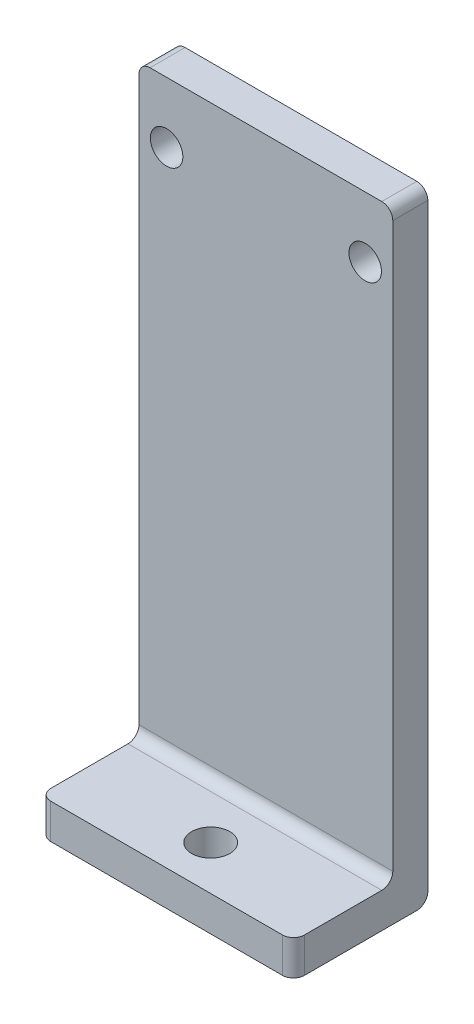
ISO-10303-21;
HEADER;
FILE_DESCRIPTION(('STEP AP214'),'2;1');
FILE_NAME('part.step','',(''),(''),'','','');
FILE_SCHEMA(('AUTOMOTIVE_DESIGN { 1 0 10303 214 1 1 1 1 }'));
ENDSEC;
DATA;
#1=APPLICATION_CONTEXT('core data for automotive mechanical design processes');
#2=APPLICATION_PROTOCOL_DEFINITION('international standard','automotive_design',2000,#1);
#3=PRODUCT_CONTEXT('',#1,'mechanical');
#4=PRODUCT('Part','Part','',(#3));
#5=PRODUCT_RELATED_PRODUCT_CATEGORY('part','',(#4));
#6=PRODUCT_DEFINITION_FORMATION('','',#4);
#7=PRODUCT_DEFINITION_CONTEXT('part definition',#1,'design');
#8=PRODUCT_DEFINITION('design','',#6,#7);
#9=PRODUCT_DEFINITION_SHAPE('','',#8);
#10=(LENGTH_UNIT() NAMED_UNIT(*) SI_UNIT(.MILLI.,.METRE.));
#11=(NAMED_UNIT(*) PLANE_ANGLE_UNIT() SI_UNIT($,.RADIAN.));
#12=(NAMED_UNIT(*) SI_UNIT($,.STERADIAN.) SOLID_ANGLE_UNIT());
#13=UNCERTAINTY_MEASURE_WITH_UNIT(LENGTH_MEASURE(1.E-05),#10,'distance_accuracy_value','');
#14=(GEOMETRIC_REPRESENTATION_CONTEXT(3) GLOBAL_UNCERTAINTY_ASSIGNED_CONTEXT((#13)) GLOBAL_UNIT_ASSIGNED_CONTEXT((#10,
#11,#12)) REPRESENTATION_CONTEXT('',''));
#15=CARTESIAN_POINT('',(0.,0.,0.));
#16=DIRECTION('',(0.,0.,1.));
#17=DIRECTION('',(1.,0.,0.));
#18=AXIS2_PLACEMENT_3D('',#15,#16,#17);
#19=CARTESIAN_POINT('',(23.,0.,3.175));
#20=DIRECTION('',(1.,0.,0.));
#21=DIRECTION('',(0.,1.,0.));
#22=AXIS2_PLACEMENT_3D('',#19,#20,#21);
#23=PLANE('',#22);
#24=DIRECTION('',(0.,0.,-1.));
#25=VECTOR('',#24,1.);
#26=CARTESIAN_POINT('',(23.,-53.06,12.175));
#27=LINE('',#26,#25);
#28=CARTESIAN_POINT('',(23.,-53.06,11.175));
#29=VERTEX_POINT('',#28);
#30=CARTESIAN_POINT('',(23.,-53.06,4.175));
#31=VERTEX_POINT('',#30);
#32=EDGE_CURVE('E170',#29,#31,#27,.T.);
#33=ORIENTED_EDGE('',*,*,#32,.F.);
#34=DIRECTION('',(0.,1.,0.));
#35=VECTOR('',#34,1.);
#36=CARTESIAN_POINT('',(23.,0.,11.175));
#37=LINE('',#36,#35);
#38=CARTESIAN_POINT('',(23.,-56.235,11.175));
#39=VERTEX_POINT('',#38);
#40=EDGE_CURVE('E265',#29,#39,#37,.F.);
#41=ORIENTED_EDGE('',*,*,#40,.T.);
#42=DIRECTION('',(0.,0.,-1.));
#43=VECTOR('',#42,1.);
#44=CARTESIAN_POINT('',(23.,-56.235,3.175));
#45=LINE('',#44,#43);
#46=CARTESIAN_POINT('',(23.,-56.235,1.));
#47=VERTEX_POINT('',#46);
#48=EDGE_CURVE('E202',#39,#47,#45,.T.);
#49=ORIENTED_EDGE('',*,*,#48,.T.);
#50=CARTESIAN_POINT('',(23.,-55.235,1.));
#51=DIRECTION('',(1.,0.,0.));
#52=DIRECTION('',(0.,1.,0.));
#53=AXIS2_PLACEMENT_3D('',#50,#51,#52);
#54=CIRCLE('',#53,1.);
#55=CARTESIAN_POINT('',(23.,-55.235,0.));
#56=VERTEX_POINT('',#55);
#57=EDGE_CURVE('E262',#47,#56,#54,.T.);
#58=ORIENTED_EDGE('',*,*,#57,.T.);
#59=DIRECTION('',(0.,-1.,0.));
#60=VECTOR('',#59,1.);
#61=CARTESIAN_POINT('',(23.,0.,0.));
#62=LINE('',#61,#60);
#63=CARTESIAN_POINT('',(23.,-1.,0.));
#64=VERTEX_POINT('',#63);
#65=EDGE_CURVE('E210',#64,#56,#62,.T.);
#66=ORIENTED_EDGE('',*,*,#65,.F.);
#67=DIRECTION('',(0.,0.,-1.));
#68=VECTOR('',#67,1.);
#69=CARTESIAN_POINT('',(23.,-1.,3.175));
#70=LINE('',#69,#68);
#71=CARTESIAN_POINT('',(23.,-1.,3.175));
#72=VERTEX_POINT('',#71);
#73=EDGE_CURVE('E259',#64,#72,#70,.F.);
#74=ORIENTED_EDGE('',*,*,#73,.T.);
#75=DIRECTION('',(0.,-1.,0.));
#76=VECTOR('',#75,1.);
#77=CARTESIAN_POINT('',(23.,0.,3.175));
#78=LINE('',#77,#76);
#79=CARTESIAN_POINT('',(23.,-52.06,3.175));
#80=VERTEX_POINT('',#79);
#81=EDGE_CURVE('E190',#72,#80,#78,.T.);
#82=ORIENTED_EDGE('',*,*,#81,.T.);
#83=CARTESIAN_POINT('',(23.,-52.06,4.175));
#84=DIRECTION('',(1.,0.,0.));
#85=DIRECTION('',(0.,1.,0.));
#86=AXIS2_PLACEMENT_3D('',#83,#84,#85);
#87=CIRCLE('',#86,1.);
#88=EDGE_CURVE('E11',#80,#31,#87,.F.);
#89=ORIENTED_EDGE('',*,*,#88,.T.);
#90=EDGE_LOOP('',(#33,#41,#49,#58,#66,#74,#82,#89));
#91=FACE_BOUND('',#90,.T.);
#92=ADVANCED_FACE('F49',(#91),#23,.T.);
#93=CARTESIAN_POINT('',(0.,0.,3.175));
#94=DIRECTION('',(0.,1.,0.));
#95=DIRECTION('',(0.,0.,1.));
#96=AXIS2_PLACEMENT_3D('',#93,#94,#95);
#97=PLANE('',#96);
#98=DIRECTION('',(1.,0.,0.));
#99=VECTOR('',#98,1.);
#100=CARTESIAN_POINT('',(0.,0.,0.));
#101=LINE('',#100,#99);
#102=CARTESIAN_POINT('',(1.,0.,0.));
#103=VERTEX_POINT('',#102);
#104=CARTESIAN_POINT('',(22.,0.,0.));
#105=VERTEX_POINT('',#104);
#106=EDGE_CURVE('E214',#103,#105,#101,.T.);
#107=ORIENTED_EDGE('',*,*,#106,.F.);
#108=DIRECTION('',(0.,0.,-1.));
#109=VECTOR('',#108,1.);
#110=CARTESIAN_POINT('',(1.,0.,3.175));
#111=LINE('',#110,#109);
#112=CARTESIAN_POINT('',(1.,0.,3.175));
#113=VERTEX_POINT('',#112);
#114=EDGE_CURVE('E278',#103,#113,#111,.F.);
#115=ORIENTED_EDGE('',*,*,#114,.T.);
#116=DIRECTION('',(1.,0.,0.));
#117=VECTOR('',#116,1.);
#118=CARTESIAN_POINT('',(0.,0.,3.175));
#119=LINE('',#118,#117);
#120=CARTESIAN_POINT('',(22.,0.,3.175));
#121=VERTEX_POINT('',#120);
#122=EDGE_CURVE('E194',#113,#121,#119,.T.);
#123=ORIENTED_EDGE('',*,*,#122,.T.);
#124=DIRECTION('',(0.,0.,-1.));
#125=VECTOR('',#124,1.);
#126=CARTESIAN_POINT('',(22.,0.,3.175));
#127=LINE('',#126,#125);
#128=EDGE_CURVE('E275',#121,#105,#127,.T.);
#129=ORIENTED_EDGE('',*,*,#128,.T.);
#130=EDGE_LOOP('',(#107,#115,#123,#129));
#131=FACE_BOUND('',#130,.T.);
#132=ADVANCED_FACE('F317',(#131),#97,.T.);
#133=CARTESIAN_POINT('',(0.,0.,3.175));
#134=DIRECTION('',(1.,0.,0.));
#135=DIRECTION('',(0.,1.,0.));
#136=AXIS2_PLACEMENT_3D('',#133,#134,#135);
#137=PLANE('',#136);
#138=DIRECTION('',(0.,0.,-1.));
#139=VECTOR('',#138,1.);
#140=CARTESIAN_POINT('',(0.,-56.235,3.175));
#141=LINE('',#140,#139);
#142=CARTESIAN_POINT('',(0.,-56.235,11.175));
#143=VERTEX_POINT('',#142);
#144=CARTESIAN_POINT('',(0.,-56.235,1.));
#145=VERTEX_POINT('',#144);
#146=EDGE_CURVE('E160',#143,#145,#141,.T.);
#147=ORIENTED_EDGE('',*,*,#146,.F.);
#148=DIRECTION('',(0.,1.,0.));
#149=VECTOR('',#148,1.);
#150=CARTESIAN_POINT('',(0.,-53.06,11.175));
#151=LINE('',#150,#149);
#152=CARTESIAN_POINT('',(0.,-53.06,11.175));
#153=VERTEX_POINT('',#152);
#154=EDGE_CURVE('E144',#143,#153,#151,.T.);
#155=ORIENTED_EDGE('',*,*,#154,.T.);
#156=DIRECTION('',(0.,0.,-1.));
#157=VECTOR('',#156,1.);
#158=CARTESIAN_POINT('',(0.,-53.06,12.175));
#159=LINE('',#158,#157);
#160=CARTESIAN_POINT('',(0.,-53.06,4.175));
#161=VERTEX_POINT('',#160);
#162=EDGE_CURVE('E158',#153,#161,#159,.T.);
#163=ORIENTED_EDGE('',*,*,#162,.T.);
#164=CARTESIAN_POINT('',(0.,-52.06,4.175));
#165=DIRECTION('',(1.,0.,0.));
#166=DIRECTION('',(0.,1.,0.));
#167=AXIS2_PLACEMENT_3D('',#164,#165,#166);
#168=CIRCLE('',#167,1.);
#169=CARTESIAN_POINT('',(0.,-52.06,3.175));
#170=VERTEX_POINT('',#169);
#171=EDGE_CURVE('E58',#161,#170,#168,.T.);
#172=ORIENTED_EDGE('',*,*,#171,.T.);
#173=DIRECTION('',(0.,-1.,0.));
#174=VECTOR('',#173,1.);
#175=CARTESIAN_POINT('',(0.,0.,3.175));
#176=LINE('',#175,#174);
#177=CARTESIAN_POINT('',(0.,-1.,3.175));
#178=VERTEX_POINT('',#177);
#179=EDGE_CURVE('E198',#178,#170,#176,.T.);
#180=ORIENTED_EDGE('',*,*,#179,.F.);
#181=DIRECTION('',(0.,0.,-1.));
#182=VECTOR('',#181,1.);
#183=CARTESIAN_POINT('',(0.,-1.,0.));
#184=LINE('',#183,#182);
#185=CARTESIAN_POINT('',(0.,-1.,0.));
#186=VERTEX_POINT('',#185);
#187=EDGE_CURVE('E238',#178,#186,#184,.T.);
#188=ORIENTED_EDGE('',*,*,#187,.T.);
#189=DIRECTION('',(0.,-1.,0.));
#190=VECTOR('',#189,1.);
#191=CARTESIAN_POINT('',(0.,0.,0.));
#192=LINE('',#191,#190);
#193=CARTESIAN_POINT('',(0.,-55.235,0.));
#194=VERTEX_POINT('',#193);
#195=EDGE_CURVE('E186',#186,#194,#192,.T.);
#196=ORIENTED_EDGE('',*,*,#195,.T.);
#197=CARTESIAN_POINT('',(0.,-55.235,1.));
#198=DIRECTION('',(1.,0.,0.));
#199=DIRECTION('',(0.,1.,0.));
#200=AXIS2_PLACEMENT_3D('',#197,#198,#199);
#201=CIRCLE('',#200,1.);
#202=EDGE_CURVE('E163',#194,#145,#201,.F.);
#203=ORIENTED_EDGE('',*,*,#202,.T.);
#204=EDGE_LOOP('',(#147,#155,#163,#172,#180,#188,#196,#203));
#205=FACE_BOUND('',#204,.T.);
#206=ADVANCED_FACE('F157',(#205),#137,.F.);
#207=CARTESIAN_POINT('',(2.5,-5.5,3.175));
#208=DIRECTION('',(0.,0.,-1.));
#209=DIRECTION('',(-1.,0.,0.));
#210=AXIS2_PLACEMENT_3D('',#207,#208,#209);
#211=CYLINDRICAL_SURFACE('',#210,1.4732);
#212=CARTESIAN_POINT('',(2.5,-5.5,3.175));
#213=DIRECTION('',(0.,0.,1.));
#214=DIRECTION('',(1.,0.,0.));
#215=AXIS2_PLACEMENT_3D('',#212,#213,#214);
#216=CIRCLE('',#215,1.4732);
#217=CARTESIAN_POINT('',(3.9732,-5.5,3.175));
#218=VERTEX_POINT('',#217);
#219=EDGE_CURVE('E185',#218,#218,#216,.T.);
#220=ORIENTED_EDGE('',*,*,#219,.T.);
#221=EDGE_LOOP('',(#220));
#222=FACE_BOUND('',#221,.T.);
#223=CARTESIAN_POINT('',(2.5,-5.5,0.));
#224=DIRECTION('',(0.,0.,1.));
#225=DIRECTION('',(1.,0.,0.));
#226=AXIS2_PLACEMENT_3D('',#223,#224,#225);
#227=CIRCLE('',#226,1.4732);
#228=CARTESIAN_POINT('',(3.9732,-5.5,0.));
#229=VERTEX_POINT('',#228);
#230=EDGE_CURVE('E206',#229,#229,#227,.T.);
#231=ORIENTED_EDGE('',*,*,#230,.F.);
#232=EDGE_LOOP('',(#231));
#233=FACE_BOUND('',#232,.T.);
#234=ADVANCED_FACE('F331',(#222,#233),#211,.F.);
#235=CARTESIAN_POINT('',(20.5,-5.5,3.175));
#236=DIRECTION('',(0.,0.,-1.));
#237=DIRECTION('',(-1.,0.,0.));
#238=AXIS2_PLACEMENT_3D('',#235,#236,#237);
#239=CYLINDRICAL_SURFACE('',#238,1.4732);
#240=CARTESIAN_POINT('',(20.5,-5.5,3.175));
#241=DIRECTION('',(0.,0.,1.));
#242=DIRECTION('',(1.,0.,0.));
#243=AXIS2_PLACEMENT_3D('',#240,#241,#242);
#244=CIRCLE('',#243,1.4732);
#245=CARTESIAN_POINT('',(21.9732,-5.5,3.175));
#246=VERTEX_POINT('',#245);
#247=EDGE_CURVE('E181',#246,#246,#244,.T.);
#248=ORIENTED_EDGE('',*,*,#247,.T.);
#249=EDGE_LOOP('',(#248));
#250=FACE_BOUND('',#249,.T.);
#251=CARTESIAN_POINT('',(20.5,-5.5,0.));
#252=DIRECTION('',(0.,0.,1.));
#253=DIRECTION('',(1.,0.,0.));
#254=AXIS2_PLACEMENT_3D('',#251,#252,#253);
#255=CIRCLE('',#254,1.4732);
#256=CARTESIAN_POINT('',(21.9732,-5.5,0.));
#257=VERTEX_POINT('',#256);
#258=EDGE_CURVE('E175',#257,#257,#255,.T.);
#259=ORIENTED_EDGE('',*,*,#258,.F.);
#260=EDGE_LOOP('',(#259));
#261=FACE_BOUND('',#260,.T.);
#262=ADVANCED_FACE('F334',(#250,#261),#239,.F.);
#263=CARTESIAN_POINT('',(0.,-56.235,3.175));
#264=DIRECTION('',(0.,1.,0.));
#265=DIRECTION('',(0.,0.,1.));
#266=AXIS2_PLACEMENT_3D('',#263,#264,#265);
#267=PLANE('',#266);
#268=CARTESIAN_POINT('',(11.5,-56.235,8.175));
#269=DIRECTION('',(0.,1.,0.));
#270=DIRECTION('',(0.,0.,1.));
#271=AXIS2_PLACEMENT_3D('',#268,#269,#270);
#272=CIRCLE('',#271,1.7272);
#273=CARTESIAN_POINT('',(11.5,-56.235,9.9022));
#274=VERTEX_POINT('',#273);
#275=EDGE_CURVE('E521',#274,#274,#272,.T.);
#276=ORIENTED_EDGE('',*,*,#275,.T.);
#277=EDGE_LOOP('',(#276));
#278=FACE_BOUND('',#277,.T.);
#279=DIRECTION('',(-1.,0.,0.));
#280=VECTOR('',#279,1.);
#281=CARTESIAN_POINT('',(0.,-56.235,12.175));
#282=LINE('',#281,#280);
#283=CARTESIAN_POINT('',(22.,-56.235,12.175));
#284=VERTEX_POINT('',#283);
#285=CARTESIAN_POINT('',(1.00000000000001,-56.235,12.175));
#286=VERTEX_POINT('',#285);
#287=EDGE_CURVE('E171',#284,#286,#282,.T.);
#288=ORIENTED_EDGE('',*,*,#287,.T.);
#289=CARTESIAN_POINT('',(1.00000000000001,-56.235,11.175));
#290=DIRECTION('',(0.,1.,0.));
#291=DIRECTION('',(0.,0.,1.));
#292=AXIS2_PLACEMENT_3D('',#289,#290,#291);
#293=CIRCLE('',#292,1.);
#294=EDGE_CURVE('E256',#286,#143,#293,.F.);
#295=ORIENTED_EDGE('',*,*,#294,.T.);
#296=ORIENTED_EDGE('',*,*,#146,.T.);
#297=DIRECTION('',(1.,0.,0.));
#298=VECTOR('',#297,1.);
#299=CARTESIAN_POINT('',(0.,-56.235,1.));
#300=LINE('',#299,#298);
#301=EDGE_CURVE('E249',#145,#47,#300,.T.);
#302=ORIENTED_EDGE('',*,*,#301,.T.);
#303=ORIENTED_EDGE('',*,*,#48,.F.);
#304=CARTESIAN_POINT('',(22.,-56.235,11.175));
#305=DIRECTION('',(0.,1.,0.));
#306=DIRECTION('',(0.,0.,1.));
#307=AXIS2_PLACEMENT_3D('',#304,#305,#306);
#308=CIRCLE('',#307,1.);
#309=EDGE_CURVE('E253',#39,#284,#308,.F.);
#310=ORIENTED_EDGE('',*,*,#309,.T.);
#311=EDGE_LOOP('',(#288,#295,#296,#302,#303,#310));
#312=FACE_BOUND('',#311,.T.);
#313=ADVANCED_FACE('F304',(#278,#312),#267,.F.);
#314=CARTESIAN_POINT('',(0.,0.,3.175));
#315=DIRECTION('',(0.,0.,1.));
#316=DIRECTION('',(1.,0.,0.));
#317=AXIS2_PLACEMENT_3D('',#314,#315,#316);
#318=PLANE('',#317);
#319=ORIENTED_EDGE('',*,*,#179,.T.);
#320=DIRECTION('',(-1.,0.,0.));
#321=VECTOR('',#320,1.);
#322=CARTESIAN_POINT('',(0.,-52.06,3.175));
#323=LINE('',#322,#321);
#324=EDGE_CURVE('E235',#170,#80,#323,.F.);
#325=ORIENTED_EDGE('',*,*,#324,.T.);
#326=ORIENTED_EDGE('',*,*,#81,.F.);
#327=CARTESIAN_POINT('',(22.,-1.,3.175));
#328=DIRECTION('',(0.,0.,1.));
#329=DIRECTION('',(1.,0.,0.));
#330=AXIS2_PLACEMENT_3D('',#327,#328,#329);
#331=CIRCLE('',#330,1.);
#332=EDGE_CURVE('E229',#72,#121,#331,.T.);
#333=ORIENTED_EDGE('',*,*,#332,.T.);
#334=ORIENTED_EDGE('',*,*,#122,.F.);
#335=CARTESIAN_POINT('',(1.,-1.,3.175));
#336=DIRECTION('',(0.,0.,1.));
#337=DIRECTION('',(1.,0.,0.));
#338=AXIS2_PLACEMENT_3D('',#335,#336,#337);
#339=CIRCLE('',#338,1.);
#340=EDGE_CURVE('E232',#113,#178,#339,.T.);
#341=ORIENTED_EDGE('',*,*,#340,.T.);
#342=EDGE_LOOP('',(#319,#325,#326,#333,#334,#341));
#343=FACE_BOUND('',#342,.T.);
#344=ORIENTED_EDGE('',*,*,#247,.F.);
#345=EDGE_LOOP('',(#344));
#346=FACE_BOUND('',#345,.T.);
#347=ORIENTED_EDGE('',*,*,#219,.F.);
#348=EDGE_LOOP('',(#347));
#349=FACE_BOUND('',#348,.T.);
#350=ADVANCED_FACE('F286',(#343,#346,#349),#318,.T.);
#351=CARTESIAN_POINT('',(0.,0.,0.));
#352=DIRECTION('',(0.,0.,1.));
#353=DIRECTION('',(1.,0.,0.));
#354=AXIS2_PLACEMENT_3D('',#351,#352,#353);
#355=PLANE('',#354);
#356=ORIENTED_EDGE('',*,*,#258,.T.);
#357=EDGE_LOOP('',(#356));
#358=FACE_BOUND('',#357,.T.);
#359=ORIENTED_EDGE('',*,*,#230,.T.);
#360=EDGE_LOOP('',(#359));
#361=FACE_BOUND('',#360,.T.);
#362=ORIENTED_EDGE('',*,*,#65,.T.);
#363=DIRECTION('',(1.,0.,0.));
#364=VECTOR('',#363,1.);
#365=CARTESIAN_POINT('',(0.,-55.235,0.));
#366=LINE('',#365,#364);
#367=EDGE_CURVE('E272',#56,#194,#366,.F.);
#368=ORIENTED_EDGE('',*,*,#367,.T.);
#369=ORIENTED_EDGE('',*,*,#195,.F.);
#370=CARTESIAN_POINT('',(1.,-1.,0.));
#371=DIRECTION('',(0.,0.,1.));
#372=DIRECTION('',(1.,0.,0.));
#373=AXIS2_PLACEMENT_3D('',#370,#371,#372);
#374=CIRCLE('',#373,1.);
#375=EDGE_CURVE('E73',#186,#103,#374,.F.);
#376=ORIENTED_EDGE('',*,*,#375,.T.);
#377=ORIENTED_EDGE('',*,*,#106,.T.);
#378=CARTESIAN_POINT('',(22.,-1.,0.));
#379=DIRECTION('',(0.,0.,1.));
#380=DIRECTION('',(1.,0.,0.));
#381=AXIS2_PLACEMENT_3D('',#378,#379,#380);
#382=CIRCLE('',#381,1.);
#383=EDGE_CURVE('E65',#105,#64,#382,.F.);
#384=ORIENTED_EDGE('',*,*,#383,.T.);
#385=EDGE_LOOP('',(#362,#368,#369,#376,#377,#384));
#386=FACE_BOUND('',#385,.T.);
#387=ADVANCED_FACE('F310',(#358,#361,#386),#355,.F.);
#388=CARTESIAN_POINT('',(0.,-53.06,12.175));
#389=DIRECTION('',(0.,-1.,0.));
#390=DIRECTION('',(0.,0.,-1.));
#391=AXIS2_PLACEMENT_3D('',#388,#389,#390);
#392=PLANE('',#391);
#393=CARTESIAN_POINT('',(11.5,-53.06,8.175));
#394=DIRECTION('',(0.,1.,0.));
#395=DIRECTION('',(0.,0.,1.));
#396=AXIS2_PLACEMENT_3D('',#393,#394,#395);
#397=CIRCLE('',#396,1.7272);
#398=CARTESIAN_POINT('',(11.5,-53.06,9.9022));
#399=VERTEX_POINT('',#398);
#400=EDGE_CURVE('E523',#399,#399,#397,.T.);
#401=ORIENTED_EDGE('',*,*,#400,.F.);
#402=EDGE_LOOP('',(#401));
#403=FACE_BOUND('',#402,.T.);
#404=ORIENTED_EDGE('',*,*,#32,.T.);
#405=DIRECTION('',(-1.,0.,0.));
#406=VECTOR('',#405,1.);
#407=CARTESIAN_POINT('',(0.,-53.06,4.175));
#408=LINE('',#407,#406);
#409=EDGE_CURVE('E151',#31,#161,#408,.T.);
#410=ORIENTED_EDGE('',*,*,#409,.T.);
#411=ORIENTED_EDGE('',*,*,#162,.F.);
#412=CARTESIAN_POINT('',(1.00000000000001,-53.06,11.175));
#413=DIRECTION('',(0.,-1.,0.));
#414=DIRECTION('',(0.,0.,-1.));
#415=AXIS2_PLACEMENT_3D('',#412,#413,#414);
#416=CIRCLE('',#415,1.);
#417=CARTESIAN_POINT('',(1.00000000000001,-53.06,12.175));
#418=VERTEX_POINT('',#417);
#419=EDGE_CURVE('E140',#153,#418,#416,.F.);
#420=ORIENTED_EDGE('',*,*,#419,.T.);
#421=DIRECTION('',(-1.,0.,0.));
#422=VECTOR('',#421,1.);
#423=CARTESIAN_POINT('',(0.,-53.06,12.175));
#424=LINE('',#423,#422);
#425=CARTESIAN_POINT('',(22.,-53.06,12.175));
#426=VERTEX_POINT('',#425);
#427=EDGE_CURVE('E178',#426,#418,#424,.T.);
#428=ORIENTED_EDGE('',*,*,#427,.F.);
#429=CARTESIAN_POINT('',(22.,-53.06,11.175));
#430=DIRECTION('',(0.,-1.,0.));
#431=DIRECTION('',(0.,0.,-1.));
#432=AXIS2_PLACEMENT_3D('',#429,#430,#431);
#433=CIRCLE('',#432,1.);
#434=EDGE_CURVE('E152',#426,#29,#433,.F.);
#435=ORIENTED_EDGE('',*,*,#434,.T.);
#436=EDGE_LOOP('',(#404,#410,#411,#420,#428,#435));
#437=FACE_BOUND('',#436,.T.);
#438=ADVANCED_FACE('F167',(#403,#437),#392,.F.);
#439=CARTESIAN_POINT('',(0.,0.,12.175));
#440=DIRECTION('',(0.,0.,1.));
#441=DIRECTION('',(1.,0.,0.));
#442=AXIS2_PLACEMENT_3D('',#439,#440,#441);
#443=PLANE('',#442);
#444=ORIENTED_EDGE('',*,*,#427,.T.);
#445=DIRECTION('',(0.,1.,0.));
#446=VECTOR('',#445,1.);
#447=CARTESIAN_POINT('',(1.00000000000001,-56.235,12.175));
#448=LINE('',#447,#446);
#449=EDGE_CURVE('E145',#418,#286,#448,.F.);
#450=ORIENTED_EDGE('',*,*,#449,.T.);
#451=ORIENTED_EDGE('',*,*,#287,.F.);
#452=DIRECTION('',(0.,1.,0.));
#453=VECTOR('',#452,1.);
#454=CARTESIAN_POINT('',(22.,0.,12.175));
#455=LINE('',#454,#453);
#456=EDGE_CURVE('E162',#284,#426,#455,.T.);
#457=ORIENTED_EDGE('',*,*,#456,.T.);
#458=EDGE_LOOP('',(#444,#450,#451,#457));
#459=FACE_BOUND('',#458,.T.);
#460=ADVANCED_FACE('F302',(#459),#443,.T.);
#461=CARTESIAN_POINT('',(11.5,-53.06,8.175));
#462=DIRECTION('',(0.,1.,0.));
#463=DIRECTION('',(0.,0.,1.));
#464=AXIS2_PLACEMENT_3D('',#461,#462,#463);
#465=CYLINDRICAL_SURFACE('',#464,1.7272);
#466=ORIENTED_EDGE('',*,*,#275,.F.);
#467=EDGE_LOOP('',(#466));
#468=FACE_BOUND('',#467,.T.);
#469=ORIENTED_EDGE('',*,*,#400,.T.);
#470=EDGE_LOOP('',(#469));
#471=FACE_BOUND('',#470,.T.);
#472=ADVANCED_FACE('F341',(#468,#471),#465,.F.);
#473=CARTESIAN_POINT('',(0.,-52.06,4.175));
#474=DIRECTION('',(-1.,0.,0.));
#475=DIRECTION('',(0.,0.,1.));
#476=AXIS2_PLACEMENT_3D('',#473,#474,#475);
#477=CYLINDRICAL_SURFACE('',#476,1.);
#478=ORIENTED_EDGE('',*,*,#88,.F.);
#479=ORIENTED_EDGE('',*,*,#324,.F.);
#480=ORIENTED_EDGE('',*,*,#171,.F.);
#481=ORIENTED_EDGE('',*,*,#409,.F.);
#482=EDGE_LOOP('',(#478,#479,#480,#481));
#483=FACE_BOUND('',#482,.T.);
#484=ADVANCED_FACE('F292',(#483),#477,.F.);
#485=CARTESIAN_POINT('',(1.,0.,11.175));
#486=DIRECTION('',(0.,-1.,0.));
#487=DIRECTION('',(1.,0.,0.));
#488=AXIS2_PLACEMENT_3D('',#485,#486,#487);
#489=CYLINDRICAL_SURFACE('',#488,1.);
#490=ORIENTED_EDGE('',*,*,#294,.F.);
#491=ORIENTED_EDGE('',*,*,#449,.F.);
#492=ORIENTED_EDGE('',*,*,#419,.F.);
#493=ORIENTED_EDGE('',*,*,#154,.F.);
#494=EDGE_LOOP('',(#490,#491,#492,#493));
#495=FACE_BOUND('',#494,.T.);
#496=ADVANCED_FACE('F143',(#495),#489,.T.);
#497=CARTESIAN_POINT('',(22.,0.,11.175));
#498=DIRECTION('',(0.,1.,0.));
#499=DIRECTION('',(-1.,0.,0.));
#500=AXIS2_PLACEMENT_3D('',#497,#498,#499);
#501=CYLINDRICAL_SURFACE('',#500,1.);
#502=ORIENTED_EDGE('',*,*,#309,.F.);
#503=ORIENTED_EDGE('',*,*,#40,.F.);
#504=ORIENTED_EDGE('',*,*,#434,.F.);
#505=ORIENTED_EDGE('',*,*,#456,.F.);
#506=EDGE_LOOP('',(#502,#503,#504,#505));
#507=FACE_BOUND('',#506,.T.);
#508=ADVANCED_FACE('F299',(#507),#501,.T.);
#509=CARTESIAN_POINT('',(0.,-55.235,1.));
#510=DIRECTION('',(1.,0.,0.));
#511=DIRECTION('',(0.,0.,-1.));
#512=AXIS2_PLACEMENT_3D('',#509,#510,#511);
#513=CYLINDRICAL_SURFACE('',#512,1.);
#514=ORIENTED_EDGE('',*,*,#202,.F.);
#515=ORIENTED_EDGE('',*,*,#367,.F.);
#516=ORIENTED_EDGE('',*,*,#57,.F.);
#517=ORIENTED_EDGE('',*,*,#301,.F.);
#518=EDGE_LOOP('',(#514,#515,#516,#517));
#519=FACE_BOUND('',#518,.T.);
#520=ADVANCED_FACE('F312',(#519),#513,.T.);
#521=CARTESIAN_POINT('',(1.,-1.,3.175));
#522=DIRECTION('',(0.,0.,1.));
#523=DIRECTION('',(1.,0.,0.));
#524=AXIS2_PLACEMENT_3D('',#521,#522,#523);
#525=CYLINDRICAL_SURFACE('',#524,1.);
#526=ORIENTED_EDGE('',*,*,#340,.F.);
#527=ORIENTED_EDGE('',*,*,#114,.F.);
#528=ORIENTED_EDGE('',*,*,#375,.F.);
#529=ORIENTED_EDGE('',*,*,#187,.F.);
#530=EDGE_LOOP('',(#526,#527,#528,#529));
#531=FACE_BOUND('',#530,.T.);
#532=ADVANCED_FACE('F314',(#531),#525,.T.);
#533=CARTESIAN_POINT('',(22.,-1.,3.175));
#534=DIRECTION('',(0.,0.,-1.));
#535=DIRECTION('',(-1.,0.,0.));
#536=AXIS2_PLACEMENT_3D('',#533,#534,#535);
#537=CYLINDRICAL_SURFACE('',#536,1.);
#538=ORIENTED_EDGE('',*,*,#332,.F.);
#539=ORIENTED_EDGE('',*,*,#73,.F.);
#540=ORIENTED_EDGE('',*,*,#383,.F.);
#541=ORIENTED_EDGE('',*,*,#128,.F.);
#542=EDGE_LOOP('',(#538,#539,#540,#541));
#543=FACE_BOUND('',#542,.T.);
#544=ADVANCED_FACE('F51',(#543),#537,.T.);
#545=CLOSED_SHELL('',(#92,#132,#206,#234,#262,#313,#350,#387,#438,#460,#472,#484,#496,#508,#520,
#532,#544));
#546=MANIFOLD_SOLID_BREP('B2',#545);
#547=ADVANCED_BREP_SHAPE_REPRESENTATION('',(#18,#546),#14);
#548=SHAPE_DEFINITION_REPRESENTATION(#9,#547);
ENDSEC;
END-ISO-10303-21;
